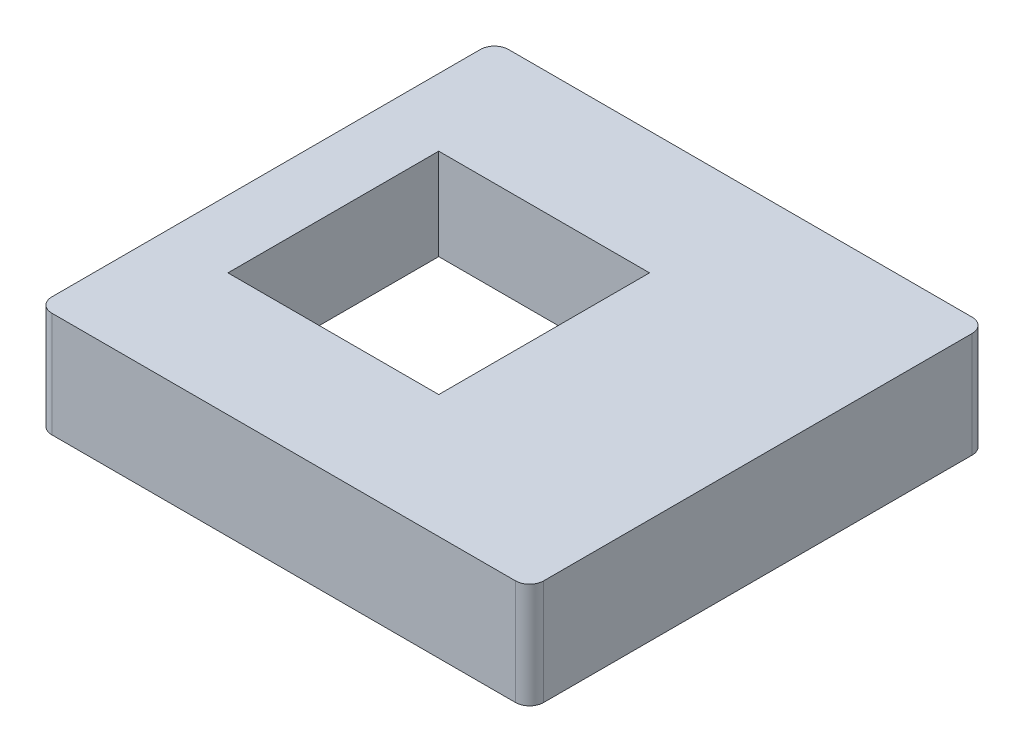
ISO-10303-21;
HEADER;
FILE_DESCRIPTION(('STEP AP214'),'2;1');
FILE_NAME('part.step','',(''),(''),'','','');
FILE_SCHEMA(('AUTOMOTIVE_DESIGN { 1 0 10303 214 1 1 1 1 }'));
ENDSEC;
DATA;
#1=APPLICATION_CONTEXT('core data for automotive mechanical design processes');
#2=APPLICATION_PROTOCOL_DEFINITION('international standard','automotive_design',2000,#1);
#3=PRODUCT_CONTEXT('',#1,'mechanical');
#4=PRODUCT('Part','Part','',(#3));
#5=PRODUCT_RELATED_PRODUCT_CATEGORY('part','',(#4));
#6=PRODUCT_DEFINITION_FORMATION('','',#4);
#7=PRODUCT_DEFINITION_CONTEXT('part definition',#1,'design');
#8=PRODUCT_DEFINITION('design','',#6,#7);
#9=PRODUCT_DEFINITION_SHAPE('','',#8);
#10=(LENGTH_UNIT() NAMED_UNIT(*) SI_UNIT(.MILLI.,.METRE.));
#11=(NAMED_UNIT(*) PLANE_ANGLE_UNIT() SI_UNIT($,.RADIAN.));
#12=(NAMED_UNIT(*) SI_UNIT($,.STERADIAN.) SOLID_ANGLE_UNIT());
#13=UNCERTAINTY_MEASURE_WITH_UNIT(LENGTH_MEASURE(1.E-05),#10,'distance_accuracy_value','');
#14=(GEOMETRIC_REPRESENTATION_CONTEXT(3) GLOBAL_UNCERTAINTY_ASSIGNED_CONTEXT((#13)) GLOBAL_UNIT_ASSIGNED_CONTEXT((#10,
#11,#12)) REPRESENTATION_CONTEXT('',''));
#15=CARTESIAN_POINT('',(0.,0.,0.));
#16=DIRECTION('',(0.,0.,1.));
#17=DIRECTION('',(1.,0.,0.));
#18=AXIS2_PLACEMENT_3D('',#15,#16,#17);
#19=CARTESIAN_POINT('',(2.,0.,-63.));
#20=DIRECTION('',(0.,-1.,0.));
#21=DIRECTION('',(0.,0.,-1.));
#22=AXIS2_PLACEMENT_3D('',#19,#20,#21);
#23=PLANE('',#22);
#24=CARTESIAN_POINT('',(2.,0.,-63.));
#25=DIRECTION('',(0.,1.,0.));
#26=DIRECTION('',(0.,0.,-1.));
#27=AXIS2_PLACEMENT_3D('',#24,#25,#26);
#28=CIRCLE('',#27,2.);
#29=CARTESIAN_POINT('',(2.00000000000001,0.,-65.));
#30=VERTEX_POINT('',#29);
#31=CARTESIAN_POINT('',(0.,0.,-63.));
#32=VERTEX_POINT('',#31);
#33=EDGE_CURVE('E272',#30,#32,#28,.T.);
#34=ORIENTED_EDGE('',*,*,#33,.F.);
#35=DIRECTION('',(-1.,0.,0.));
#36=VECTOR('',#35,1.);
#37=CARTESIAN_POINT('',(2.00000000000001,0.,-65.));
#38=LINE('',#37,#36);
#39=CARTESIAN_POINT('',(68.,0.,-65.));
#40=VERTEX_POINT('',#39);
#41=EDGE_CURVE('E277',#40,#30,#38,.T.);
#42=ORIENTED_EDGE('',*,*,#41,.F.);
#43=CARTESIAN_POINT('',(68.,0.,-63.));
#44=DIRECTION('',(0.,1.,0.));
#45=DIRECTION('',(0.,0.,-1.));
#46=AXIS2_PLACEMENT_3D('',#43,#44,#45);
#47=CIRCLE('',#46,2.);
#48=CARTESIAN_POINT('',(70.,0.,-63.));
#49=VERTEX_POINT('',#48);
#50=EDGE_CURVE('E304',#49,#40,#47,.T.);
#51=ORIENTED_EDGE('',*,*,#50,.F.);
#52=DIRECTION('',(0.,0.,-1.));
#53=VECTOR('',#52,1.);
#54=CARTESIAN_POINT('',(70.,0.,-2.00000000000001));
#55=LINE('',#54,#53);
#56=CARTESIAN_POINT('',(70.,0.,-2.00000000000001));
#57=VERTEX_POINT('',#56);
#58=EDGE_CURVE('E302',#57,#49,#55,.T.);
#59=ORIENTED_EDGE('',*,*,#58,.F.);
#60=CARTESIAN_POINT('',(68.,0.,-2.));
#61=DIRECTION('',(0.,1.,0.));
#62=DIRECTION('',(0.,0.,1.));
#63=AXIS2_PLACEMENT_3D('',#60,#61,#62);
#64=CIRCLE('',#63,2.);
#65=CARTESIAN_POINT('',(68.,0.,0.));
#66=VERTEX_POINT('',#65);
#67=EDGE_CURVE('E300',#66,#57,#64,.T.);
#68=ORIENTED_EDGE('',*,*,#67,.F.);
#69=DIRECTION('',(1.,0.,0.));
#70=VECTOR('',#69,1.);
#71=CARTESIAN_POINT('',(2.00000000000001,0.,0.));
#72=LINE('',#71,#70);
#73=CARTESIAN_POINT('',(2.00000000000001,0.,0.));
#74=VERTEX_POINT('',#73);
#75=EDGE_CURVE('E298',#74,#66,#72,.T.);
#76=ORIENTED_EDGE('',*,*,#75,.F.);
#77=CARTESIAN_POINT('',(2.,0.,-2.));
#78=DIRECTION('',(0.,1.,0.));
#79=DIRECTION('',(0.,0.,-1.));
#80=AXIS2_PLACEMENT_3D('',#77,#78,#79);
#81=CIRCLE('',#80,2.);
#82=CARTESIAN_POINT('',(0.,0.,-2.00000000000001));
#83=VERTEX_POINT('',#82);
#84=EDGE_CURVE('E296',#83,#74,#81,.T.);
#85=ORIENTED_EDGE('',*,*,#84,.F.);
#86=DIRECTION('',(0.,0.,1.));
#87=VECTOR('',#86,1.);
#88=CARTESIAN_POINT('',(0.,0.,-2.00000000000001));
#89=LINE('',#88,#87);
#90=EDGE_CURVE('E294',#32,#83,#89,.T.);
#91=ORIENTED_EDGE('',*,*,#90,.F.);
#92=EDGE_LOOP('',(#34,#42,#51,#59,#68,#76,#85,#91));
#93=FACE_BOUND('',#92,.T.);
#94=DIRECTION('',(0.,0.,-1.));
#95=VECTOR('',#94,1.);
#96=CARTESIAN_POINT('',(59.0731707317024,0.,0.));
#97=LINE('',#96,#95);
#98=CARTESIAN_POINT('',(59.0731707317024,0.,-7.5));
#99=VERTEX_POINT('',#98);
#100=CARTESIAN_POINT('',(59.0731707317024,0.,-57.5));
#101=VERTEX_POINT('',#100);
#102=EDGE_CURVE('E259',#99,#101,#97,.T.);
#103=ORIENTED_EDGE('',*,*,#102,.T.);
#104=DIRECTION('',(-1.,0.,0.));
#105=VECTOR('',#104,1.);
#106=CARTESIAN_POINT('',(59.0731707317024,0.,-57.5));
#107=LINE('',#106,#105);
#108=CARTESIAN_POINT('',(5.07317073170241,0.,-57.5));
#109=VERTEX_POINT('',#108);
#110=EDGE_CURVE('E241',#101,#109,#107,.T.);
#111=ORIENTED_EDGE('',*,*,#110,.T.);
#112=DIRECTION('',(0.,0.,-1.));
#113=VECTOR('',#112,1.);
#114=CARTESIAN_POINT('',(5.07317073170241,0.,0.));
#115=LINE('',#114,#113);
#116=CARTESIAN_POINT('',(5.07317073170241,0.,-7.5));
#117=VERTEX_POINT('',#116);
#118=EDGE_CURVE('E265',#117,#109,#115,.T.);
#119=ORIENTED_EDGE('',*,*,#118,.F.);
#120=DIRECTION('',(-1.,0.,0.));
#121=VECTOR('',#120,1.);
#122=CARTESIAN_POINT('',(59.0731707317024,0.,-7.5));
#123=LINE('',#122,#121);
#124=EDGE_CURVE('E249',#99,#117,#123,.T.);
#125=ORIENTED_EDGE('',*,*,#124,.F.);
#126=EDGE_LOOP('',(#103,#111,#119,#125));
#127=FACE_BOUND('',#126,.T.);
#128=ADVANCED_FACE('F39',(#93,#127),#23,.T.);
#129=CARTESIAN_POINT('',(17.0731707317024,15.,-47.5));
#130=DIRECTION('',(0.,0.,1.));
#131=DIRECTION('',(1.,0.,0.));
#132=AXIS2_PLACEMENT_3D('',#129,#130,#131);
#133=PLANE('',#132);
#134=DIRECTION('',(0.,-1.,0.));
#135=VECTOR('',#134,1.);
#136=CARTESIAN_POINT('',(39.5731707317024,15.,-47.5));
#137=LINE('',#136,#135);
#138=CARTESIAN_POINT('',(39.5731707317024,15.,-47.5));
#139=VERTEX_POINT('',#138);
#140=CARTESIAN_POINT('',(39.5731707317024,2.,-47.5));
#141=VERTEX_POINT('',#140);
#142=EDGE_CURVE('E199',#139,#141,#137,.T.);
#143=ORIENTED_EDGE('',*,*,#142,.F.);
#144=DIRECTION('',(-1.,0.,0.));
#145=VECTOR('',#144,1.);
#146=CARTESIAN_POINT('',(17.0731707317024,15.,-47.5));
#147=LINE('',#146,#145);
#148=CARTESIAN_POINT('',(9.57317073170241,15.,-47.5));
#149=VERTEX_POINT('',#148);
#150=EDGE_CURVE('E270',#139,#149,#147,.T.);
#151=ORIENTED_EDGE('',*,*,#150,.T.);
#152=DIRECTION('',(0.,1.,0.));
#153=VECTOR('',#152,1.);
#154=CARTESIAN_POINT('',(9.57317073170241,2.,-47.5));
#155=LINE('',#154,#153);
#156=CARTESIAN_POINT('',(9.57317073170241,2.,-47.5));
#157=VERTEX_POINT('',#156);
#158=EDGE_CURVE('E218',#157,#149,#155,.T.);
#159=ORIENTED_EDGE('',*,*,#158,.F.);
#160=DIRECTION('',(1.,0.,0.));
#161=VECTOR('',#160,1.);
#162=CARTESIAN_POINT('',(17.0731707317024,2.,-47.5));
#163=LINE('',#162,#161);
#164=EDGE_CURVE('E244',#157,#141,#163,.T.);
#165=ORIENTED_EDGE('',*,*,#164,.T.);
#166=EDGE_LOOP('',(#143,#151,#159,#165));
#167=FACE_BOUND('',#166,.T.);
#168=ADVANCED_FACE('F347',(#167),#133,.T.);
#169=CARTESIAN_POINT('',(2.,15.,-63.));
#170=DIRECTION('',(0.,-1.,0.));
#171=DIRECTION('',(0.,0.,-1.));
#172=AXIS2_PLACEMENT_3D('',#169,#170,#171);
#173=PLANE('',#172);
#174=ORIENTED_EDGE('',*,*,#150,.F.);
#175=DIRECTION('',(0.,0.,-1.));
#176=VECTOR('',#175,1.);
#177=CARTESIAN_POINT('',(39.5731707317024,15.,-17.5));
#178=LINE('',#177,#176);
#179=CARTESIAN_POINT('',(39.5731707317024,15.,-17.5));
#180=VERTEX_POINT('',#179);
#181=EDGE_CURVE('E210',#180,#139,#178,.T.);
#182=ORIENTED_EDGE('',*,*,#181,.F.);
#183=DIRECTION('',(1.,0.,0.));
#184=VECTOR('',#183,1.);
#185=CARTESIAN_POINT('',(17.0731707317024,15.,-17.5));
#186=LINE('',#185,#184);
#187=CARTESIAN_POINT('',(9.57317073170241,15.,-17.5));
#188=VERTEX_POINT('',#187);
#189=EDGE_CURVE('E267',#188,#180,#186,.T.);
#190=ORIENTED_EDGE('',*,*,#189,.F.);
#191=DIRECTION('',(0.,0.,1.));
#192=VECTOR('',#191,1.);
#193=CARTESIAN_POINT('',(9.57317073170241,15.,-17.5));
#194=LINE('',#193,#192);
#195=EDGE_CURVE('E221',#149,#188,#194,.T.);
#196=ORIENTED_EDGE('',*,*,#195,.F.);
#197=EDGE_LOOP('',(#174,#182,#190,#196));
#198=FACE_BOUND('',#197,.T.);
#199=CARTESIAN_POINT('',(2.,15.,-63.));
#200=DIRECTION('',(0.,1.,0.));
#201=DIRECTION('',(0.,0.,-1.));
#202=AXIS2_PLACEMENT_3D('',#199,#200,#201);
#203=CIRCLE('',#202,2.);
#204=CARTESIAN_POINT('',(2.00000000000001,15.,-65.));
#205=VERTEX_POINT('',#204);
#206=CARTESIAN_POINT('',(0.,15.,-63.));
#207=VERTEX_POINT('',#206);
#208=EDGE_CURVE('E273',#205,#207,#203,.T.);
#209=ORIENTED_EDGE('',*,*,#208,.T.);
#210=DIRECTION('',(0.,0.,1.));
#211=VECTOR('',#210,1.);
#212=CARTESIAN_POINT('',(0.,15.,-2.00000000000001));
#213=LINE('',#212,#211);
#214=CARTESIAN_POINT('',(0.,15.,-2.00000000000001));
#215=VERTEX_POINT('',#214);
#216=EDGE_CURVE('E276',#207,#215,#213,.T.);
#217=ORIENTED_EDGE('',*,*,#216,.T.);
#218=CARTESIAN_POINT('',(2.,15.,-2.));
#219=DIRECTION('',(0.,1.,0.));
#220=DIRECTION('',(0.,0.,-1.));
#221=AXIS2_PLACEMENT_3D('',#218,#219,#220);
#222=CIRCLE('',#221,2.);
#223=CARTESIAN_POINT('',(2.00000000000001,15.,0.));
#224=VERTEX_POINT('',#223);
#225=EDGE_CURVE('E279',#215,#224,#222,.T.);
#226=ORIENTED_EDGE('',*,*,#225,.T.);
#227=DIRECTION('',(1.,0.,0.));
#228=VECTOR('',#227,1.);
#229=CARTESIAN_POINT('',(2.00000000000001,15.,0.));
#230=LINE('',#229,#228);
#231=CARTESIAN_POINT('',(68.,15.,0.));
#232=VERTEX_POINT('',#231);
#233=EDGE_CURVE('E281',#224,#232,#230,.T.);
#234=ORIENTED_EDGE('',*,*,#233,.T.);
#235=CARTESIAN_POINT('',(68.,15.,-2.));
#236=DIRECTION('',(0.,1.,0.));
#237=DIRECTION('',(0.,0.,1.));
#238=AXIS2_PLACEMENT_3D('',#235,#236,#237);
#239=CIRCLE('',#238,2.);
#240=CARTESIAN_POINT('',(70.,15.,-2.00000000000001));
#241=VERTEX_POINT('',#240);
#242=EDGE_CURVE('E283',#232,#241,#239,.T.);
#243=ORIENTED_EDGE('',*,*,#242,.T.);
#244=DIRECTION('',(0.,0.,-1.));
#245=VECTOR('',#244,1.);
#246=CARTESIAN_POINT('',(70.,15.,-2.00000000000001));
#247=LINE('',#246,#245);
#248=CARTESIAN_POINT('',(70.,15.,-63.));
#249=VERTEX_POINT('',#248);
#250=EDGE_CURVE('E285',#241,#249,#247,.T.);
#251=ORIENTED_EDGE('',*,*,#250,.T.);
#252=CARTESIAN_POINT('',(68.,15.,-63.));
#253=DIRECTION('',(0.,1.,0.));
#254=DIRECTION('',(0.,0.,-1.));
#255=AXIS2_PLACEMENT_3D('',#252,#253,#254);
#256=CIRCLE('',#255,2.);
#257=CARTESIAN_POINT('',(68.,15.,-65.));
#258=VERTEX_POINT('',#257);
#259=EDGE_CURVE('E287',#249,#258,#256,.T.);
#260=ORIENTED_EDGE('',*,*,#259,.T.);
#261=DIRECTION('',(-1.,0.,0.));
#262=VECTOR('',#261,1.);
#263=CARTESIAN_POINT('',(2.00000000000001,15.,-65.));
#264=LINE('',#263,#262);
#265=EDGE_CURVE('E289',#258,#205,#264,.T.);
#266=ORIENTED_EDGE('',*,*,#265,.T.);
#267=EDGE_LOOP('',(#209,#217,#226,#234,#243,#251,#260,#266));
#268=FACE_BOUND('',#267,.T.);
#269=ADVANCED_FACE('F344',(#198,#268),#173,.F.);
#270=CARTESIAN_POINT('',(2.,15.,-63.));
#271=DIRECTION('',(0.,-1.,0.));
#272=DIRECTION('',(0.,0.,-1.));
#273=AXIS2_PLACEMENT_3D('',#270,#271,#272);
#274=CYLINDRICAL_SURFACE('',#273,2.);
#275=ORIENTED_EDGE('',*,*,#33,.T.);
#276=DIRECTION('',(0.,-1.,0.));
#277=VECTOR('',#276,1.);
#278=CARTESIAN_POINT('',(0.,15.,-63.));
#279=LINE('',#278,#277);
#280=EDGE_CURVE('E327',#207,#32,#279,.T.);
#281=ORIENTED_EDGE('',*,*,#280,.F.);
#282=ORIENTED_EDGE('',*,*,#208,.F.);
#283=DIRECTION('',(0.,-1.,0.));
#284=VECTOR('',#283,1.);
#285=CARTESIAN_POINT('',(2.00000000000001,15.,-65.));
#286=LINE('',#285,#284);
#287=EDGE_CURVE('E291',#205,#30,#286,.T.);
#288=ORIENTED_EDGE('',*,*,#287,.T.);
#289=EDGE_LOOP('',(#275,#281,#282,#288));
#290=FACE_BOUND('',#289,.T.);
#291=ADVANCED_FACE('F41',(#290),#274,.T.);
#292=CARTESIAN_POINT('',(0.,15.,-2.00000000000001));
#293=DIRECTION('',(1.,0.,0.));
#294=DIRECTION('',(0.,0.,-1.));
#295=AXIS2_PLACEMENT_3D('',#292,#293,#294);
#296=PLANE('',#295);
#297=ORIENTED_EDGE('',*,*,#90,.T.);
#298=DIRECTION('',(0.,-1.,0.));
#299=VECTOR('',#298,1.);
#300=CARTESIAN_POINT('',(0.,15.,-2.00000000000001));
#301=LINE('',#300,#299);
#302=EDGE_CURVE('E324',#215,#83,#301,.T.);
#303=ORIENTED_EDGE('',*,*,#302,.F.);
#304=ORIENTED_EDGE('',*,*,#216,.F.);
#305=ORIENTED_EDGE('',*,*,#280,.T.);
#306=EDGE_LOOP('',(#297,#303,#304,#305));
#307=FACE_BOUND('',#306,.T.);
#308=ADVANCED_FACE('F385',(#307),#296,.F.);
#309=CARTESIAN_POINT('',(2.,15.,-2.));
#310=DIRECTION('',(0.,-1.,0.));
#311=DIRECTION('',(0.,0.,-1.));
#312=AXIS2_PLACEMENT_3D('',#309,#310,#311);
#313=CYLINDRICAL_SURFACE('',#312,2.);
#314=ORIENTED_EDGE('',*,*,#84,.T.);
#315=DIRECTION('',(0.,-1.,0.));
#316=VECTOR('',#315,1.);
#317=CARTESIAN_POINT('',(2.00000000000001,15.,0.));
#318=LINE('',#317,#316);
#319=EDGE_CURVE('E321',#224,#74,#318,.T.);
#320=ORIENTED_EDGE('',*,*,#319,.F.);
#321=ORIENTED_EDGE('',*,*,#225,.F.);
#322=ORIENTED_EDGE('',*,*,#302,.T.);
#323=EDGE_LOOP('',(#314,#320,#321,#322));
#324=FACE_BOUND('',#323,.T.);
#325=ADVANCED_FACE('F382',(#324),#313,.T.);
#326=CARTESIAN_POINT('',(2.00000000000001,15.,0.));
#327=DIRECTION('',(0.,0.,-1.));
#328=DIRECTION('',(-1.,0.,0.));
#329=AXIS2_PLACEMENT_3D('',#326,#327,#328);
#330=PLANE('',#329);
#331=ORIENTED_EDGE('',*,*,#75,.T.);
#332=DIRECTION('',(0.,-1.,0.));
#333=VECTOR('',#332,1.);
#334=CARTESIAN_POINT('',(68.,15.,0.));
#335=LINE('',#334,#333);
#336=EDGE_CURVE('E318',#232,#66,#335,.T.);
#337=ORIENTED_EDGE('',*,*,#336,.F.);
#338=ORIENTED_EDGE('',*,*,#233,.F.);
#339=ORIENTED_EDGE('',*,*,#319,.T.);
#340=EDGE_LOOP('',(#331,#337,#338,#339));
#341=FACE_BOUND('',#340,.T.);
#342=ADVANCED_FACE('F378',(#341),#330,.F.);
#343=CARTESIAN_POINT('',(68.,15.,-2.));
#344=DIRECTION('',(0.,-1.,0.));
#345=DIRECTION('',(0.,0.,-1.));
#346=AXIS2_PLACEMENT_3D('',#343,#344,#345);
#347=CYLINDRICAL_SURFACE('',#346,2.);
#348=ORIENTED_EDGE('',*,*,#67,.T.);
#349=DIRECTION('',(0.,-1.,0.));
#350=VECTOR('',#349,1.);
#351=CARTESIAN_POINT('',(70.,15.,-2.00000000000001));
#352=LINE('',#351,#350);
#353=EDGE_CURVE('E315',#241,#57,#352,.T.);
#354=ORIENTED_EDGE('',*,*,#353,.F.);
#355=ORIENTED_EDGE('',*,*,#242,.F.);
#356=ORIENTED_EDGE('',*,*,#336,.T.);
#357=EDGE_LOOP('',(#348,#354,#355,#356));
#358=FACE_BOUND('',#357,.T.);
#359=ADVANCED_FACE('F374',(#358),#347,.T.);
#360=CARTESIAN_POINT('',(70.,15.,-2.00000000000001));
#361=DIRECTION('',(-1.,0.,0.));
#362=DIRECTION('',(0.,0.,1.));
#363=AXIS2_PLACEMENT_3D('',#360,#361,#362);
#364=PLANE('',#363);
#365=ORIENTED_EDGE('',*,*,#58,.T.);
#366=DIRECTION('',(0.,-1.,0.));
#367=VECTOR('',#366,1.);
#368=CARTESIAN_POINT('',(70.,15.,-63.));
#369=LINE('',#368,#367);
#370=EDGE_CURVE('E312',#249,#49,#369,.T.);
#371=ORIENTED_EDGE('',*,*,#370,.F.);
#372=ORIENTED_EDGE('',*,*,#250,.F.);
#373=ORIENTED_EDGE('',*,*,#353,.T.);
#374=EDGE_LOOP('',(#365,#371,#372,#373));
#375=FACE_BOUND('',#374,.T.);
#376=ADVANCED_FACE('F370',(#375),#364,.F.);
#377=CARTESIAN_POINT('',(68.,15.,-63.));
#378=DIRECTION('',(0.,-1.,0.));
#379=DIRECTION('',(0.,0.,-1.));
#380=AXIS2_PLACEMENT_3D('',#377,#378,#379);
#381=CYLINDRICAL_SURFACE('',#380,2.);
#382=ORIENTED_EDGE('',*,*,#50,.T.);
#383=DIRECTION('',(0.,-1.,0.));
#384=VECTOR('',#383,1.);
#385=CARTESIAN_POINT('',(68.,15.,-65.));
#386=LINE('',#385,#384);
#387=EDGE_CURVE('E309',#258,#40,#386,.T.);
#388=ORIENTED_EDGE('',*,*,#387,.F.);
#389=ORIENTED_EDGE('',*,*,#259,.F.);
#390=ORIENTED_EDGE('',*,*,#370,.T.);
#391=EDGE_LOOP('',(#382,#388,#389,#390));
#392=FACE_BOUND('',#391,.T.);
#393=ADVANCED_FACE('F366',(#392),#381,.T.);
#394=CARTESIAN_POINT('',(2.00000000000001,15.,-65.));
#395=DIRECTION('',(0.,0.,1.));
#396=DIRECTION('',(1.,0.,0.));
#397=AXIS2_PLACEMENT_3D('',#394,#395,#396);
#398=PLANE('',#397);
#399=ORIENTED_EDGE('',*,*,#41,.T.);
#400=ORIENTED_EDGE('',*,*,#287,.F.);
#401=ORIENTED_EDGE('',*,*,#265,.F.);
#402=ORIENTED_EDGE('',*,*,#387,.T.);
#403=EDGE_LOOP('',(#399,#400,#401,#402));
#404=FACE_BOUND('',#403,.T.);
#405=ADVANCED_FACE('F362',(#404),#398,.F.);
#406=CARTESIAN_POINT('',(17.0731707317024,15.,-17.5));
#407=DIRECTION('',(0.,0.,-1.));
#408=DIRECTION('',(-1.,0.,0.));
#409=AXIS2_PLACEMENT_3D('',#406,#407,#408);
#410=PLANE('',#409);
#411=DIRECTION('',(0.,1.,0.));
#412=VECTOR('',#411,1.);
#413=CARTESIAN_POINT('',(39.5731707317024,2.,-17.5));
#414=LINE('',#413,#412);
#415=CARTESIAN_POINT('',(39.5731707317024,2.,-17.5));
#416=VERTEX_POINT('',#415);
#417=EDGE_CURVE('E208',#416,#180,#414,.T.);
#418=ORIENTED_EDGE('',*,*,#417,.F.);
#419=DIRECTION('',(1.,0.,0.));
#420=VECTOR('',#419,1.);
#421=CARTESIAN_POINT('',(17.0731707317024,2.,-17.5));
#422=LINE('',#421,#420);
#423=CARTESIAN_POINT('',(9.57317073170241,2.,-17.5));
#424=VERTEX_POINT('',#423);
#425=EDGE_CURVE('E54',#424,#416,#422,.T.);
#426=ORIENTED_EDGE('',*,*,#425,.F.);
#427=DIRECTION('',(0.,-1.,0.));
#428=VECTOR('',#427,1.);
#429=CARTESIAN_POINT('',(9.57317073170241,2.,-17.5));
#430=LINE('',#429,#428);
#431=EDGE_CURVE('E213',#188,#424,#430,.T.);
#432=ORIENTED_EDGE('',*,*,#431,.F.);
#433=ORIENTED_EDGE('',*,*,#189,.T.);
#434=EDGE_LOOP('',(#418,#426,#432,#433));
#435=FACE_BOUND('',#434,.T.);
#436=ADVANCED_FACE('F340',(#435),#410,.T.);
#437=CARTESIAN_POINT('',(5.07317073170241,2.,0.));
#438=DIRECTION('',(0.,-1.,0.));
#439=DIRECTION('',(0.,0.,-1.));
#440=AXIS2_PLACEMENT_3D('',#437,#438,#439);
#441=PLANE('',#440);
#442=DIRECTION('',(0.,0.,-1.));
#443=VECTOR('',#442,1.);
#444=CARTESIAN_POINT('',(9.57317073170241,2.,-17.5));
#445=LINE('',#444,#443);
#446=EDGE_CURVE('E215',#424,#157,#445,.T.);
#447=ORIENTED_EDGE('',*,*,#446,.F.);
#448=ORIENTED_EDGE('',*,*,#425,.T.);
#449=DIRECTION('',(0.,0.,1.));
#450=VECTOR('',#449,1.);
#451=CARTESIAN_POINT('',(39.5731707317024,2.,-24.));
#452=LINE('',#451,#450);
#453=CARTESIAN_POINT('',(39.5731707317024,2.,-24.));
#454=VERTEX_POINT('',#453);
#455=EDGE_CURVE('E206',#454,#416,#452,.T.);
#456=ORIENTED_EDGE('',*,*,#455,.F.);
#457=DIRECTION('',(-1.,0.,0.));
#458=VECTOR('',#457,1.);
#459=CARTESIAN_POINT('',(5.07317073170241,2.,-24.));
#460=LINE('',#459,#458);
#461=CARTESIAN_POINT('',(58.0731707317024,2.,-24.));
#462=VERTEX_POINT('',#461);
#463=EDGE_CURVE('E47',#462,#454,#460,.T.);
#464=ORIENTED_EDGE('',*,*,#463,.F.);
#465=DIRECTION('',(0.,0.,-1.));
#466=VECTOR('',#465,1.);
#467=CARTESIAN_POINT('',(58.0731707317024,2.,0.));
#468=LINE('',#467,#466);
#469=CARTESIAN_POINT('',(58.0731707317024,2.,-41.));
#470=VERTEX_POINT('',#469);
#471=EDGE_CURVE('E186',#462,#470,#468,.T.);
#472=ORIENTED_EDGE('',*,*,#471,.T.);
#473=DIRECTION('',(1.,0.,0.));
#474=VECTOR('',#473,1.);
#475=CARTESIAN_POINT('',(5.07317073170241,2.,-41.));
#476=LINE('',#475,#474);
#477=CARTESIAN_POINT('',(39.5731707317024,2.,-41.));
#478=VERTEX_POINT('',#477);
#479=EDGE_CURVE('E11',#478,#470,#476,.T.);
#480=ORIENTED_EDGE('',*,*,#479,.F.);
#481=DIRECTION('',(0.,0.,1.));
#482=VECTOR('',#481,1.);
#483=CARTESIAN_POINT('',(39.5731707317024,2.,-47.5));
#484=LINE('',#483,#482);
#485=EDGE_CURVE('E183',#141,#478,#484,.T.);
#486=ORIENTED_EDGE('',*,*,#485,.F.);
#487=ORIENTED_EDGE('',*,*,#164,.F.);
#488=EDGE_LOOP('',(#447,#448,#456,#464,#472,#480,#486,#487));
#489=FACE_BOUND('',#488,.T.);
#490=DIRECTION('',(0.,0.,-1.));
#491=VECTOR('',#490,1.);
#492=CARTESIAN_POINT('',(5.07317073170241,2.,0.));
#493=LINE('',#492,#491);
#494=CARTESIAN_POINT('',(5.07317073170241,2.,-7.5));
#495=VERTEX_POINT('',#494);
#496=CARTESIAN_POINT('',(5.07317073170241,2.,-57.5));
#497=VERTEX_POINT('',#496);
#498=EDGE_CURVE('E263',#495,#497,#493,.T.);
#499=ORIENTED_EDGE('',*,*,#498,.T.);
#500=DIRECTION('',(1.,0.,0.));
#501=VECTOR('',#500,1.);
#502=CARTESIAN_POINT('',(59.0731707317024,2.,-57.5));
#503=LINE('',#502,#501);
#504=CARTESIAN_POINT('',(59.0731707317024,2.,-57.5));
#505=VERTEX_POINT('',#504);
#506=EDGE_CURVE('E235',#497,#505,#503,.T.);
#507=ORIENTED_EDGE('',*,*,#506,.T.);
#508=DIRECTION('',(0.,0.,-1.));
#509=VECTOR('',#508,1.);
#510=CARTESIAN_POINT('',(59.0731707317024,2.,0.));
#511=LINE('',#510,#509);
#512=CARTESIAN_POINT('',(59.0731707317024,2.,-7.5));
#513=VERTEX_POINT('',#512);
#514=EDGE_CURVE('E261',#513,#505,#511,.T.);
#515=ORIENTED_EDGE('',*,*,#514,.F.);
#516=DIRECTION('',(1.,0.,0.));
#517=VECTOR('',#516,1.);
#518=CARTESIAN_POINT('',(59.0731707317024,2.,-7.5));
#519=LINE('',#518,#517);
#520=EDGE_CURVE('E255',#495,#513,#519,.T.);
#521=ORIENTED_EDGE('',*,*,#520,.F.);
#522=EDGE_LOOP('',(#499,#507,#515,#521));
#523=FACE_BOUND('',#522,.T.);
#524=ADVANCED_FACE('F180',(#489,#523),#441,.T.);
#525=CARTESIAN_POINT('',(5.07317073170241,0.,0.));
#526=DIRECTION('',(1.,0.,0.));
#527=DIRECTION('',(0.,0.,-1.));
#528=AXIS2_PLACEMENT_3D('',#525,#526,#527);
#529=PLANE('',#528);
#530=ORIENTED_EDGE('',*,*,#118,.T.);
#531=DIRECTION('',(0.,1.,0.));
#532=VECTOR('',#531,1.);
#533=CARTESIAN_POINT('',(5.07317073170241,2.,-57.5));
#534=LINE('',#533,#532);
#535=EDGE_CURVE('E238',#109,#497,#534,.T.);
#536=ORIENTED_EDGE('',*,*,#535,.T.);
#537=ORIENTED_EDGE('',*,*,#498,.F.);
#538=DIRECTION('',(0.,1.,0.));
#539=VECTOR('',#538,1.);
#540=CARTESIAN_POINT('',(5.07317073170241,2.,-7.5));
#541=LINE('',#540,#539);
#542=EDGE_CURVE('E252',#117,#495,#541,.T.);
#543=ORIENTED_EDGE('',*,*,#542,.F.);
#544=EDGE_LOOP('',(#530,#536,#537,#543));
#545=FACE_BOUND('',#544,.T.);
#546=ADVANCED_FACE('F429',(#545),#529,.T.);
#547=CARTESIAN_POINT('',(59.0731707317024,0.,0.));
#548=DIRECTION('',(-1.,0.,0.));
#549=DIRECTION('',(0.,0.,-1.));
#550=AXIS2_PLACEMENT_3D('',#547,#548,#549);
#551=PLANE('',#550);
#552=ORIENTED_EDGE('',*,*,#514,.T.);
#553=DIRECTION('',(0.,-1.,0.));
#554=VECTOR('',#553,1.);
#555=CARTESIAN_POINT('',(59.0731707317024,2.,-57.5));
#556=LINE('',#555,#554);
#557=EDGE_CURVE('E231',#505,#101,#556,.T.);
#558=ORIENTED_EDGE('',*,*,#557,.T.);
#559=ORIENTED_EDGE('',*,*,#102,.F.);
#560=DIRECTION('',(0.,-1.,0.));
#561=VECTOR('',#560,1.);
#562=CARTESIAN_POINT('',(59.0731707317024,2.,-7.5));
#563=LINE('',#562,#561);
#564=EDGE_CURVE('E246',#513,#99,#563,.T.);
#565=ORIENTED_EDGE('',*,*,#564,.F.);
#566=EDGE_LOOP('',(#552,#558,#559,#565));
#567=FACE_BOUND('',#566,.T.);
#568=ADVANCED_FACE('F425',(#567),#551,.T.);
#569=CARTESIAN_POINT('',(0.,0.,-7.5));
#570=DIRECTION('',(0.,0.,-1.));
#571=DIRECTION('',(-1.,0.,0.));
#572=AXIS2_PLACEMENT_3D('',#569,#570,#571);
#573=PLANE('',#572);
#574=ORIENTED_EDGE('',*,*,#564,.T.);
#575=ORIENTED_EDGE('',*,*,#124,.T.);
#576=ORIENTED_EDGE('',*,*,#542,.T.);
#577=ORIENTED_EDGE('',*,*,#520,.T.);
#578=EDGE_LOOP('',(#574,#575,#576,#577));
#579=FACE_BOUND('',#578,.T.);
#580=ADVANCED_FACE('F431',(#579),#573,.T.);
#581=CARTESIAN_POINT('',(0.,0.,-57.5));
#582=DIRECTION('',(0.,0.,1.));
#583=DIRECTION('',(-1.,0.,0.));
#584=AXIS2_PLACEMENT_3D('',#581,#582,#583);
#585=PLANE('',#584);
#586=ORIENTED_EDGE('',*,*,#557,.F.);
#587=ORIENTED_EDGE('',*,*,#506,.F.);
#588=ORIENTED_EDGE('',*,*,#535,.F.);
#589=ORIENTED_EDGE('',*,*,#110,.F.);
#590=EDGE_LOOP('',(#586,#587,#588,#589));
#591=FACE_BOUND('',#590,.T.);
#592=ADVANCED_FACE('F423',(#591),#585,.T.);
#593=CARTESIAN_POINT('',(58.0731707317024,10.,-41.));
#594=DIRECTION('',(0.,0.,-1.));
#595=DIRECTION('',(-1.,0.,0.));
#596=AXIS2_PLACEMENT_3D('',#593,#594,#595);
#597=PLANE('',#596);
#598=ORIENTED_EDGE('',*,*,#479,.T.);
#599=DIRECTION('',(0.,-1.,0.));
#600=VECTOR('',#599,1.);
#601=CARTESIAN_POINT('',(58.0731707317024,10.,-41.));
#602=LINE('',#601,#600);
#603=CARTESIAN_POINT('',(58.0731707317024,10.,-41.));
#604=VERTEX_POINT('',#603);
#605=EDGE_CURVE('E62',#604,#470,#602,.T.);
#606=ORIENTED_EDGE('',*,*,#605,.F.);
#607=DIRECTION('',(-1.,0.,0.));
#608=VECTOR('',#607,1.);
#609=CARTESIAN_POINT('',(58.0731707317024,10.,-41.));
#610=LINE('',#609,#608);
#611=CARTESIAN_POINT('',(39.5731707317024,10.,-41.));
#612=VERTEX_POINT('',#611);
#613=EDGE_CURVE('E191',#604,#612,#610,.T.);
#614=ORIENTED_EDGE('',*,*,#613,.T.);
#615=DIRECTION('',(0.,1.,0.));
#616=VECTOR('',#615,1.);
#617=CARTESIAN_POINT('',(39.5731707317024,2.,-41.));
#618=LINE('',#617,#616);
#619=EDGE_CURVE('E189',#478,#612,#618,.T.);
#620=ORIENTED_EDGE('',*,*,#619,.F.);
#621=EDGE_LOOP('',(#598,#606,#614,#620));
#622=FACE_BOUND('',#621,.T.);
#623=ADVANCED_FACE('F190',(#622),#597,.F.);
#624=CARTESIAN_POINT('',(58.0731707317024,10.,-41.));
#625=DIRECTION('',(0.,1.,0.));
#626=DIRECTION('',(0.,0.,1.));
#627=AXIS2_PLACEMENT_3D('',#624,#625,#626);
#628=PLANE('',#627);
#629=DIRECTION('',(-1.,0.,0.));
#630=VECTOR('',#629,1.);
#631=CARTESIAN_POINT('',(58.0731707317024,10.,-24.));
#632=LINE('',#631,#630);
#633=CARTESIAN_POINT('',(58.0731707317024,10.,-24.));
#634=VERTEX_POINT('',#633);
#635=CARTESIAN_POINT('',(39.5731707317024,10.,-24.));
#636=VERTEX_POINT('',#635);
#637=EDGE_CURVE('E229',#634,#636,#632,.T.);
#638=ORIENTED_EDGE('',*,*,#637,.T.);
#639=DIRECTION('',(0.,0.,1.));
#640=VECTOR('',#639,1.);
#641=CARTESIAN_POINT('',(39.5731707317024,10.,-41.));
#642=LINE('',#641,#640);
#643=EDGE_CURVE('E195',#612,#636,#642,.T.);
#644=ORIENTED_EDGE('',*,*,#643,.F.);
#645=ORIENTED_EDGE('',*,*,#613,.F.);
#646=DIRECTION('',(0.,0.,-1.));
#647=VECTOR('',#646,1.);
#648=CARTESIAN_POINT('',(58.0731707317024,10.,-41.));
#649=LINE('',#648,#647);
#650=EDGE_CURVE('E227',#634,#604,#649,.T.);
#651=ORIENTED_EDGE('',*,*,#650,.F.);
#652=EDGE_LOOP('',(#638,#644,#645,#651));
#653=FACE_BOUND('',#652,.T.);
#654=ADVANCED_FACE('F456',(#653),#628,.F.);
#655=CARTESIAN_POINT('',(58.0731707317024,10.,-24.));
#656=DIRECTION('',(0.,0.,1.));
#657=DIRECTION('',(1.,0.,0.));
#658=AXIS2_PLACEMENT_3D('',#655,#656,#657);
#659=PLANE('',#658);
#660=ORIENTED_EDGE('',*,*,#463,.T.);
#661=DIRECTION('',(0.,-1.,0.));
#662=VECTOR('',#661,1.);
#663=CARTESIAN_POINT('',(39.5731707317024,10.,-24.));
#664=LINE('',#663,#662);
#665=EDGE_CURVE('E203',#636,#454,#664,.T.);
#666=ORIENTED_EDGE('',*,*,#665,.F.);
#667=ORIENTED_EDGE('',*,*,#637,.F.);
#668=DIRECTION('',(0.,1.,0.));
#669=VECTOR('',#668,1.);
#670=CARTESIAN_POINT('',(58.0731707317024,10.,-24.));
#671=LINE('',#670,#669);
#672=EDGE_CURVE('E225',#462,#634,#671,.T.);
#673=ORIENTED_EDGE('',*,*,#672,.F.);
#674=EDGE_LOOP('',(#660,#666,#667,#673));
#675=FACE_BOUND('',#674,.T.);
#676=ADVANCED_FACE('F333',(#675),#659,.F.);
#677=CARTESIAN_POINT('',(58.0731707317024,0.,0.));
#678=DIRECTION('',(-1.,0.,0.));
#679=DIRECTION('',(0.,0.,1.));
#680=AXIS2_PLACEMENT_3D('',#677,#678,#679);
#681=PLANE('',#680);
#682=ORIENTED_EDGE('',*,*,#672,.T.);
#683=ORIENTED_EDGE('',*,*,#650,.T.);
#684=ORIENTED_EDGE('',*,*,#605,.T.);
#685=ORIENTED_EDGE('',*,*,#471,.F.);
#686=EDGE_LOOP('',(#682,#683,#684,#685));
#687=FACE_BOUND('',#686,.T.);
#688=ADVANCED_FACE('F471',(#687),#681,.T.);
#689=CARTESIAN_POINT('',(9.57317073170241,0.,0.));
#690=DIRECTION('',(-1.,0.,0.));
#691=DIRECTION('',(0.,0.,1.));
#692=AXIS2_PLACEMENT_3D('',#689,#690,#691);
#693=PLANE('',#692);
#694=ORIENTED_EDGE('',*,*,#431,.T.);
#695=ORIENTED_EDGE('',*,*,#446,.T.);
#696=ORIENTED_EDGE('',*,*,#158,.T.);
#697=ORIENTED_EDGE('',*,*,#195,.T.);
#698=EDGE_LOOP('',(#694,#695,#696,#697));
#699=FACE_BOUND('',#698,.T.);
#700=ADVANCED_FACE('F338',(#699),#693,.F.);
#701=CARTESIAN_POINT('',(39.5731707317024,0.,0.));
#702=DIRECTION('',(-1.,0.,0.));
#703=DIRECTION('',(0.,0.,1.));
#704=AXIS2_PLACEMENT_3D('',#701,#702,#703);
#705=PLANE('',#704);
#706=ORIENTED_EDGE('',*,*,#485,.T.);
#707=ORIENTED_EDGE('',*,*,#619,.T.);
#708=ORIENTED_EDGE('',*,*,#643,.T.);
#709=ORIENTED_EDGE('',*,*,#665,.T.);
#710=ORIENTED_EDGE('',*,*,#455,.T.);
#711=ORIENTED_EDGE('',*,*,#417,.T.);
#712=ORIENTED_EDGE('',*,*,#181,.T.);
#713=ORIENTED_EDGE('',*,*,#142,.T.);
#714=EDGE_LOOP('',(#706,#707,#708,#709,#710,#711,#712,#713));
#715=FACE_BOUND('',#714,.T.);
#716=ADVANCED_FACE('F197',(#715),#705,.T.);
#717=CLOSED_SHELL('',(#128,#168,#269,#291,#308,#325,#342,#359,#376,#393,#405,#436,#524,#546,
#568,#580,#592,#623,#654,#676,#688,#700,#716));
#718=MANIFOLD_SOLID_BREP('B2',#717);
#719=ADVANCED_BREP_SHAPE_REPRESENTATION('',(#18,#718),#14);
#720=SHAPE_DEFINITION_REPRESENTATION(#9,#719);
ENDSEC;
END-ISO-10303-21;
